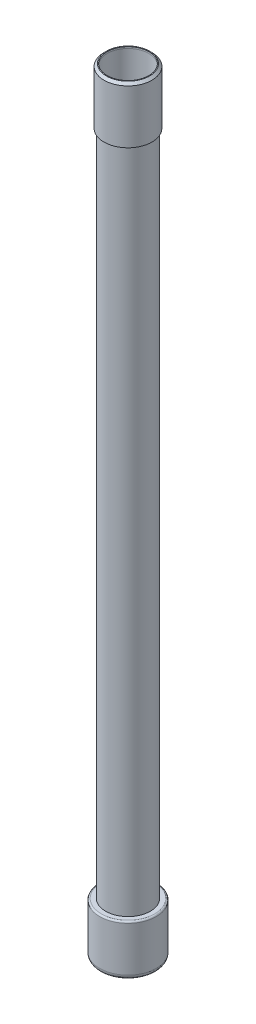
ISO-10303-21;
HEADER;
FILE_DESCRIPTION(('STEP AP214'),'2;1');
FILE_NAME('part.step','',(''),(''),'','','');
FILE_SCHEMA(('AUTOMOTIVE_DESIGN { 1 0 10303 214 1 1 1 1 }'));
ENDSEC;
DATA;
#1=APPLICATION_CONTEXT('core data for automotive mechanical design processes');
#2=APPLICATION_PROTOCOL_DEFINITION('international standard','automotive_design',2000,#1);
#3=PRODUCT_CONTEXT('',#1,'mechanical');
#4=PRODUCT('Part','Part','',(#3));
#5=PRODUCT_RELATED_PRODUCT_CATEGORY('part','',(#4));
#6=PRODUCT_DEFINITION_FORMATION('','',#4);
#7=PRODUCT_DEFINITION_CONTEXT('part definition',#1,'design');
#8=PRODUCT_DEFINITION('design','',#6,#7);
#9=PRODUCT_DEFINITION_SHAPE('','',#8);
#10=(LENGTH_UNIT() NAMED_UNIT(*) SI_UNIT(.MILLI.,.METRE.));
#11=(NAMED_UNIT(*) PLANE_ANGLE_UNIT() SI_UNIT($,.RADIAN.));
#12=(NAMED_UNIT(*) SI_UNIT($,.STERADIAN.) SOLID_ANGLE_UNIT());
#13=UNCERTAINTY_MEASURE_WITH_UNIT(LENGTH_MEASURE(1.E-05),#10,'distance_accuracy_value','');
#14=(GEOMETRIC_REPRESENTATION_CONTEXT(3) GLOBAL_UNCERTAINTY_ASSIGNED_CONTEXT((#13)) GLOBAL_UNIT_ASSIGNED_CONTEXT((#10,
#11,#12)) REPRESENTATION_CONTEXT('',''));
#15=CARTESIAN_POINT('',(0.,0.,0.));
#16=DIRECTION('',(0.,0.,1.));
#17=DIRECTION('',(1.,0.,0.));
#18=AXIS2_PLACEMENT_3D('',#15,#16,#17);
#19=CARTESIAN_POINT('',(13.,241.,0.));
#20=DIRECTION('',(0.,-1.,0.));
#21=DIRECTION('',(0.,0.,-1.));
#22=AXIS2_PLACEMENT_3D('',#19,#20,#21);
#23=PLANE('',#22);
#24=CARTESIAN_POINT('',(0.,241.,0.));
#25=DIRECTION('',(0.,-1.,0.));
#26=DIRECTION('',(0.,0.,-1.));
#27=AXIS2_PLACEMENT_3D('',#24,#25,#26);
#28=CIRCLE('',#27,13.5);
#29=CARTESIAN_POINT('',(0.,241.,-13.5));
#30=VERTEX_POINT('',#29);
#31=EDGE_CURVE('E49',#30,#30,#28,.F.);
#32=ORIENTED_EDGE('',*,*,#31,.T.);
#33=EDGE_LOOP('',(#32));
#34=FACE_BOUND('',#33,.T.);
#35=CARTESIAN_POINT('',(0.,241.,0.));
#36=DIRECTION('',(0.,1.,0.));
#37=DIRECTION('',(0.,0.,1.));
#38=AXIS2_PLACEMENT_3D('',#35,#36,#37);
#39=CIRCLE('',#38,13.);
#40=CARTESIAN_POINT('',(0.,241.,13.));
#41=VERTEX_POINT('',#40);
#42=EDGE_CURVE('E68',#41,#41,#39,.T.);
#43=ORIENTED_EDGE('',*,*,#42,.F.);
#44=EDGE_LOOP('',(#43));
#45=FACE_BOUND('',#44,.T.);
#46=ADVANCED_FACE('F42',(#34,#45),#23,.F.);
#47=CARTESIAN_POINT('',(0.,250.648791431477,0.));
#48=DIRECTION('',(0.,1.,0.));
#49=DIRECTION('',(0.,0.,1.));
#50=AXIS2_PLACEMENT_3D('',#47,#48,#49);
#51=CYLINDRICAL_SURFACE('',#50,15.);
#52=CARTESIAN_POINT('',(0.,239.5,0.));
#53=DIRECTION('',(0.,-1.,0.));
#54=DIRECTION('',(0.,0.,-1.));
#55=AXIS2_PLACEMENT_3D('',#52,#53,#54);
#56=CIRCLE('',#55,15.);
#57=CARTESIAN_POINT('',(0.,239.5,-15.));
#58=VERTEX_POINT('',#57);
#59=EDGE_CURVE('E11',#58,#58,#56,.T.);
#60=ORIENTED_EDGE('',*,*,#59,.T.);
#61=EDGE_LOOP('',(#60));
#62=FACE_BOUND('',#61,.T.);
#63=CARTESIAN_POINT('',(0.,206.,0.));
#64=DIRECTION('',(0.,1.,0.));
#65=DIRECTION('',(0.,0.,1.));
#66=AXIS2_PLACEMENT_3D('',#63,#64,#65);
#67=CIRCLE('',#66,15.);
#68=CARTESIAN_POINT('',(0.,206.,15.));
#69=VERTEX_POINT('',#68);
#70=EDGE_CURVE('E53',#69,#69,#67,.T.);
#71=ORIENTED_EDGE('',*,*,#70,.T.);
#72=EDGE_LOOP('',(#71));
#73=FACE_BOUND('',#72,.T.);
#74=ADVANCED_FACE('F75',(#62,#73),#51,.T.);
#75=CARTESIAN_POINT('',(15.,206.,0.));
#76=DIRECTION('',(0.,1.,0.));
#77=DIRECTION('',(0.,0.,1.));
#78=AXIS2_PLACEMENT_3D('',#75,#76,#77);
#79=PLANE('',#78);
#80=ORIENTED_EDGE('',*,*,#70,.F.);
#81=EDGE_LOOP('',(#80));
#82=FACE_BOUND('',#81,.T.);
#83=CARTESIAN_POINT('',(0.,206.,0.));
#84=DIRECTION('',(0.,1.,0.));
#85=DIRECTION('',(0.,0.,1.));
#86=AXIS2_PLACEMENT_3D('',#83,#84,#85);
#87=CIRCLE('',#86,14.);
#88=CARTESIAN_POINT('',(0.,206.,14.));
#89=VERTEX_POINT('',#88);
#90=EDGE_CURVE('E57',#89,#89,#87,.T.);
#91=ORIENTED_EDGE('',*,*,#90,.T.);
#92=EDGE_LOOP('',(#91));
#93=FACE_BOUND('',#92,.T.);
#94=ADVANCED_FACE('F79',(#82,#93),#79,.F.);
#95=CARTESIAN_POINT('',(0.,250.648791431477,0.));
#96=DIRECTION('',(0.,1.,0.));
#97=DIRECTION('',(0.,0.,1.));
#98=AXIS2_PLACEMENT_3D('',#95,#96,#97);
#99=CYLINDRICAL_SURFACE('',#98,14.);
#100=ORIENTED_EDGE('',*,*,#90,.F.);
#101=EDGE_LOOP('',(#100));
#102=FACE_BOUND('',#101,.T.);
#103=CARTESIAN_POINT('',(0.,240.,0.));
#104=DIRECTION('',(0.,1.,0.));
#105=DIRECTION('',(0.,0.,1.));
#106=AXIS2_PLACEMENT_3D('',#103,#104,#105);
#107=CIRCLE('',#106,14.);
#108=CARTESIAN_POINT('',(0.,240.,14.));
#109=VERTEX_POINT('',#108);
#110=EDGE_CURVE('E62',#109,#109,#107,.T.);
#111=ORIENTED_EDGE('',*,*,#110,.T.);
#112=EDGE_LOOP('',(#111));
#113=FACE_BOUND('',#112,.T.);
#114=ADVANCED_FACE('F84',(#102,#113),#99,.F.);
#115=CARTESIAN_POINT('',(14.,240.,0.));
#116=DIRECTION('',(0.,1.,0.));
#117=DIRECTION('',(0.,0.,1.));
#118=AXIS2_PLACEMENT_3D('',#115,#116,#117);
#119=PLANE('',#118);
#120=ORIENTED_EDGE('',*,*,#110,.F.);
#121=EDGE_LOOP('',(#120));
#122=FACE_BOUND('',#121,.T.);
#123=CARTESIAN_POINT('',(0.,240.,0.));
#124=DIRECTION('',(0.,1.,0.));
#125=DIRECTION('',(0.,0.,1.));
#126=AXIS2_PLACEMENT_3D('',#123,#124,#125);
#127=CIRCLE('',#126,13.);
#128=CARTESIAN_POINT('',(0.,240.,13.));
#129=VERTEX_POINT('',#128);
#130=EDGE_CURVE('E65',#129,#129,#127,.T.);
#131=ORIENTED_EDGE('',*,*,#130,.T.);
#132=EDGE_LOOP('',(#131));
#133=FACE_BOUND('',#132,.T.);
#134=ADVANCED_FACE('F88',(#122,#133),#119,.F.);
#135=CARTESIAN_POINT('',(0.,250.648791431477,0.));
#136=DIRECTION('',(0.,1.,0.));
#137=DIRECTION('',(0.,0.,1.));
#138=AXIS2_PLACEMENT_3D('',#135,#136,#137);
#139=CYLINDRICAL_SURFACE('',#138,13.);
#140=ORIENTED_EDGE('',*,*,#130,.F.);
#141=EDGE_LOOP('',(#140));
#142=FACE_BOUND('',#141,.T.);
#143=ORIENTED_EDGE('',*,*,#42,.T.);
#144=EDGE_LOOP('',(#143));
#145=FACE_BOUND('',#144,.T.);
#146=ADVANCED_FACE('F72',(#142,#145),#139,.F.);
#147=CARTESIAN_POINT('',(0.,241.,0.));
#148=DIRECTION('',(0.,-1.,0.));
#149=DIRECTION('',(0.,0.,-1.));
#150=AXIS2_PLACEMENT_3D('',#147,#148,#149);
#151=CONICAL_SURFACE('',#150,13.5,0.785398163397452);
#152=ORIENTED_EDGE('',*,*,#59,.F.);
#153=EDGE_LOOP('',(#152));
#154=FACE_BOUND('',#153,.T.);
#155=ORIENTED_EDGE('',*,*,#31,.F.);
#156=EDGE_LOOP('',(#155));
#157=FACE_BOUND('',#156,.T.);
#158=ADVANCED_FACE('F44',(#154,#157),#151,.T.);
#159=CLOSED_SHELL('',(#46,#74,#94,#114,#134,#146,#158));
#160=MANIFOLD_SOLID_BREP('B2',#159);
#161=CARTESIAN_POINT('',(0.,-191.854456481253,0.));
#162=DIRECTION('',(0.,1.,0.));
#163=DIRECTION('',(0.,0.,1.));
#164=AXIS2_PLACEMENT_3D('',#161,#162,#163);
#165=CYLINDRICAL_SURFACE('',#164,17.75);
#166=CARTESIAN_POINT('',(0.,-212.,0.));
#167=DIRECTION('',(0.,-1.,0.));
#168=DIRECTION('',(0.,0.,-1.));
#169=AXIS2_PLACEMENT_3D('',#166,#167,#168);
#170=CIRCLE('',#169,17.75);
#171=CARTESIAN_POINT('',(0.,-212.,-17.75));
#172=VERTEX_POINT('',#171);
#173=EDGE_CURVE('E41',#172,#172,#170,.T.);
#174=ORIENTED_EDGE('',*,*,#173,.T.);
#175=EDGE_LOOP('',(#174));
#176=FACE_BOUND('',#175,.T.);
#177=CARTESIAN_POINT('',(0.,-240.052731737533,0.));
#178=DIRECTION('',(0.,1.,0.));
#179=DIRECTION('',(0.,0.,1.));
#180=AXIS2_PLACEMENT_3D('',#177,#178,#179);
#181=CIRCLE('',#180,17.75);
#182=CARTESIAN_POINT('',(0.,-240.052731737533,17.75));
#183=VERTEX_POINT('',#182);
#184=EDGE_CURVE('E171',#183,#183,#181,.T.);
#185=ORIENTED_EDGE('',*,*,#184,.T.);
#186=EDGE_LOOP('',(#185));
#187=FACE_BOUND('',#186,.T.);
#188=ADVANCED_FACE('F156',(#176,#187),#165,.T.);
#189=CARTESIAN_POINT('',(13.,-211.,0.));
#190=DIRECTION('',(0.,-1.,0.));
#191=DIRECTION('',(0.,0.,-1.));
#192=AXIS2_PLACEMENT_3D('',#189,#190,#191);
#193=PLANE('',#192);
#194=CARTESIAN_POINT('',(0.,-211.,0.));
#195=DIRECTION('',(0.,-1.,0.));
#196=DIRECTION('',(0.,0.,-1.));
#197=AXIS2_PLACEMENT_3D('',#194,#195,#196);
#198=CIRCLE('',#197,16.75);
#199=CARTESIAN_POINT('',(0.,-211.,-16.75));
#200=VERTEX_POINT('',#199);
#201=EDGE_CURVE('E163',#200,#200,#198,.F.);
#202=ORIENTED_EDGE('',*,*,#201,.T.);
#203=EDGE_LOOP('',(#202));
#204=FACE_BOUND('',#203,.T.);
#205=CARTESIAN_POINT('',(0.,-211.,0.));
#206=DIRECTION('',(0.,1.,0.));
#207=DIRECTION('',(0.,0.,1.));
#208=AXIS2_PLACEMENT_3D('',#205,#206,#207);
#209=CIRCLE('',#208,13.);
#210=CARTESIAN_POINT('',(0.,-211.,13.));
#211=VERTEX_POINT('',#210);
#212=EDGE_CURVE('E176',#211,#211,#209,.T.);
#213=ORIENTED_EDGE('',*,*,#212,.F.);
#214=EDGE_LOOP('',(#213));
#215=FACE_BOUND('',#214,.T.);
#216=ADVANCED_FACE('F188',(#204,#215),#193,.F.);
#217=CARTESIAN_POINT('',(0.,-191.854456481253,0.));
#218=DIRECTION('',(0.,1.,0.));
#219=DIRECTION('',(0.,0.,1.));
#220=AXIS2_PLACEMENT_3D('',#217,#218,#219);
#221=CYLINDRICAL_SURFACE('',#220,13.);
#222=CARTESIAN_POINT('',(0.,-240.,0.));
#223=DIRECTION('',(0.,1.,0.));
#224=DIRECTION('',(0.,0.,1.));
#225=AXIS2_PLACEMENT_3D('',#222,#223,#224);
#226=CIRCLE('',#225,13.);
#227=CARTESIAN_POINT('',(0.,-240.,13.));
#228=VERTEX_POINT('',#227);
#229=EDGE_CURVE('E179',#228,#228,#226,.T.);
#230=ORIENTED_EDGE('',*,*,#229,.F.);
#231=EDGE_LOOP('',(#230));
#232=FACE_BOUND('',#231,.T.);
#233=ORIENTED_EDGE('',*,*,#212,.T.);
#234=EDGE_LOOP('',(#233));
#235=FACE_BOUND('',#234,.T.);
#236=ADVANCED_FACE('F185',(#232,#235),#221,.F.);
#237=CARTESIAN_POINT('',(0.,-240.,0.));
#238=DIRECTION('',(0.,-1.,0.));
#239=DIRECTION('',(0.,0.,-1.));
#240=AXIS2_PLACEMENT_3D('',#237,#238,#239);
#241=PLANE('',#240);
#242=ORIENTED_EDGE('',*,*,#229,.T.);
#243=EDGE_LOOP('',(#242));
#244=FACE_BOUND('',#243,.T.);
#245=ADVANCED_FACE('F183',(#244),#241,.F.);
#246=CARTESIAN_POINT('',(0.,-204.6171875,0.));
#247=DIRECTION('',(0.,1.,0.));
#248=DIRECTION('',(1.,0.,0.));
#249=AXIS2_PLACEMENT_3D('',#246,#247,#248);
#250=SPHERICAL_SURFACE('',#249,41.3828125);
#251=CARTESIAN_POINT('',(0.,-242.82237329813,0.));
#252=DIRECTION('',(0.,1.,0.));
#253=DIRECTION('',(0.,0.,1.));
#254=AXIS2_PLACEMENT_3D('',#251,#252,#253);
#255=CIRCLE('',#254,15.9028597598209);
#256=CARTESIAN_POINT('',(0.,-242.82237329813,15.9028597598209));
#257=VERTEX_POINT('',#256);
#258=EDGE_CURVE('E167',#257,#257,#255,.F.);
#259=ORIENTED_EDGE('',*,*,#258,.T.);
#260=EDGE_LOOP('',(#259));
#261=FACE_BOUND('',#260,.T.);
#262=ADVANCED_FACE('F201',(#261),#250,.T.);
#263=CARTESIAN_POINT('',(0.,-240.052731737533,0.));
#264=DIRECTION('',(0.,1.,0.));
#265=DIRECTION('',(0.,0.,1.));
#266=AXIS2_PLACEMENT_3D('',#263,#264,#265);
#267=TOROIDAL_SURFACE('',#266,14.75,3.);
#268=ORIENTED_EDGE('',*,*,#258,.F.);
#269=EDGE_LOOP('',(#268));
#270=FACE_BOUND('',#269,.T.);
#271=ORIENTED_EDGE('',*,*,#184,.F.);
#272=EDGE_LOOP('',(#271));
#273=FACE_BOUND('',#272,.T.);
#274=ADVANCED_FACE('F199',(#270,#273),#267,.T.);
#275=CARTESIAN_POINT('',(0.,-212.,0.));
#276=DIRECTION('',(0.,-1.,0.));
#277=DIRECTION('',(0.,0.,-1.));
#278=AXIS2_PLACEMENT_3D('',#275,#276,#277);
#279=TOROIDAL_SURFACE('',#278,16.75,1.);
#280=ORIENTED_EDGE('',*,*,#173,.F.);
#281=EDGE_LOOP('',(#280));
#282=FACE_BOUND('',#281,.T.);
#283=ORIENTED_EDGE('',*,*,#201,.F.);
#284=EDGE_LOOP('',(#283));
#285=FACE_BOUND('',#284,.T.);
#286=ADVANCED_FACE('F158',(#282,#285),#279,.T.);
#287=CLOSED_SHELL('',(#188,#216,#236,#245,#262,#274,#286));
#288=MANIFOLD_SOLID_BREP('B6',#287);
#289=CARTESIAN_POINT('',(0.,240.,0.));
#290=DIRECTION('',(0.,1.,0.));
#291=DIRECTION('',(0.,0.,1.));
#292=AXIS2_PLACEMENT_3D('',#289,#290,#291);
#293=PLANE('',#292);
#294=CARTESIAN_POINT('',(0.,240.,0.));
#295=DIRECTION('',(0.,1.,0.));
#296=DIRECTION('',(0.,0.,1.));
#297=AXIS2_PLACEMENT_3D('',#294,#295,#296);
#298=CIRCLE('',#297,14.);
#299=CARTESIAN_POINT('',(0.,240.,14.));
#300=VERTEX_POINT('',#299);
#301=EDGE_CURVE('E155',#300,#300,#298,.T.);
#302=ORIENTED_EDGE('',*,*,#301,.T.);
#303=EDGE_LOOP('',(#302));
#304=FACE_BOUND('',#303,.T.);
#305=CARTESIAN_POINT('',(0.,240.,0.));
#306=DIRECTION('',(0.,1.,0.));
#307=DIRECTION('',(0.,0.,1.));
#308=AXIS2_PLACEMENT_3D('',#305,#306,#307);
#309=CIRCLE('',#308,13.);
#310=CARTESIAN_POINT('',(0.,240.,13.));
#311=VERTEX_POINT('',#310);
#312=EDGE_CURVE('E268',#311,#311,#309,.T.);
#313=ORIENTED_EDGE('',*,*,#312,.F.);
#314=EDGE_LOOP('',(#313));
#315=FACE_BOUND('',#314,.T.);
#316=ADVANCED_FACE('F257',(#304,#315),#293,.T.);
#317=CARTESIAN_POINT('',(0.,-240.,0.));
#318=DIRECTION('',(0.,1.,0.));
#319=DIRECTION('',(0.,0.,1.));
#320=AXIS2_PLACEMENT_3D('',#317,#318,#319);
#321=PLANE('',#320);
#322=CARTESIAN_POINT('',(0.,-240.,0.));
#323=DIRECTION('',(0.,1.,0.));
#324=DIRECTION('',(0.,0.,1.));
#325=AXIS2_PLACEMENT_3D('',#322,#323,#324);
#326=CIRCLE('',#325,14.);
#327=CARTESIAN_POINT('',(0.,-240.,14.));
#328=VERTEX_POINT('',#327);
#329=EDGE_CURVE('E261',#328,#328,#326,.T.);
#330=ORIENTED_EDGE('',*,*,#329,.F.);
#331=EDGE_LOOP('',(#330));
#332=FACE_BOUND('',#331,.T.);
#333=CARTESIAN_POINT('',(0.,-240.,0.));
#334=DIRECTION('',(0.,1.,0.));
#335=DIRECTION('',(0.,0.,1.));
#336=AXIS2_PLACEMENT_3D('',#333,#334,#335);
#337=CIRCLE('',#336,13.);
#338=CARTESIAN_POINT('',(0.,-240.,13.));
#339=VERTEX_POINT('',#338);
#340=EDGE_CURVE('E270',#339,#339,#337,.T.);
#341=ORIENTED_EDGE('',*,*,#340,.T.);
#342=EDGE_LOOP('',(#341));
#343=FACE_BOUND('',#342,.T.);
#344=ADVANCED_FACE('F280',(#332,#343),#321,.F.);
#345=CARTESIAN_POINT('',(0.,240.,0.));
#346=DIRECTION('',(0.,-1.,0.));
#347=DIRECTION('',(0.,0.,-1.));
#348=AXIS2_PLACEMENT_3D('',#345,#346,#347);
#349=CYLINDRICAL_SURFACE('',#348,14.);
#350=ORIENTED_EDGE('',*,*,#301,.F.);
#351=EDGE_LOOP('',(#350));
#352=FACE_BOUND('',#351,.T.);
#353=ORIENTED_EDGE('',*,*,#329,.T.);
#354=EDGE_LOOP('',(#353));
#355=FACE_BOUND('',#354,.T.);
#356=ADVANCED_FACE('F259',(#352,#355),#349,.T.);
#357=CARTESIAN_POINT('',(0.,240.,0.));
#358=DIRECTION('',(0.,-1.,0.));
#359=DIRECTION('',(0.,0.,-1.));
#360=AXIS2_PLACEMENT_3D('',#357,#358,#359);
#361=CYLINDRICAL_SURFACE('',#360,13.);
#362=ORIENTED_EDGE('',*,*,#312,.T.);
#363=EDGE_LOOP('',(#362));
#364=FACE_BOUND('',#363,.T.);
#365=ORIENTED_EDGE('',*,*,#340,.F.);
#366=EDGE_LOOP('',(#365));
#367=FACE_BOUND('',#366,.T.);
#368=ADVANCED_FACE('F276',(#364,#367),#361,.F.);
#369=CLOSED_SHELL('',(#316,#344,#356,#368));
#370=MANIFOLD_SOLID_BREP('B36',#369);
#371=ADVANCED_BREP_SHAPE_REPRESENTATION('',(#18,#160,#288,#370),#14);
#372=SHAPE_DEFINITION_REPRESENTATION(#9,#371);
ENDSEC;
END-ISO-10303-21;
